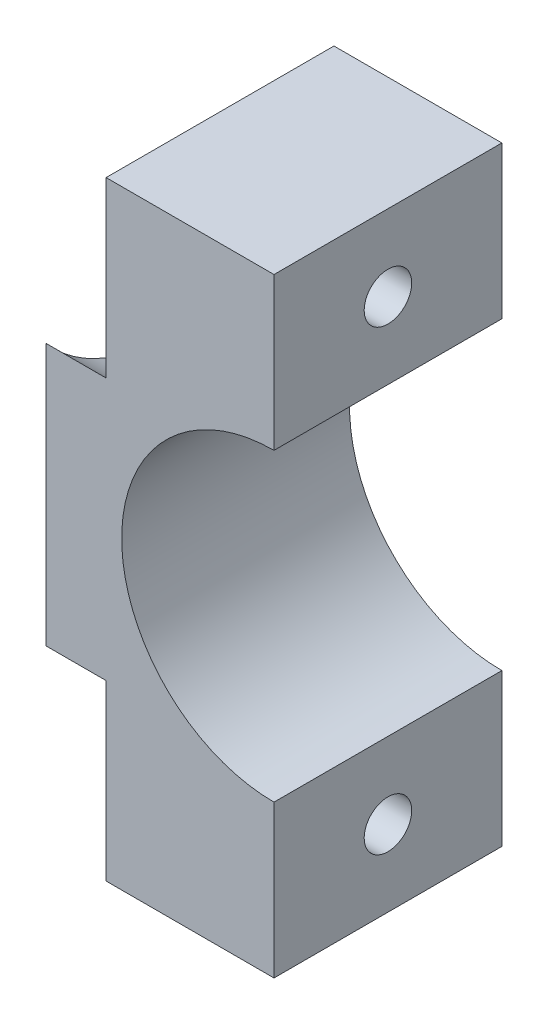
ISO-10303-21;
HEADER;
FILE_DESCRIPTION(('STEP AP214'),'2;1');
FILE_NAME('part.step','',(''),(''),'','','');
FILE_SCHEMA(('AUTOMOTIVE_DESIGN { 1 0 10303 214 1 1 1 1 }'));
ENDSEC;
DATA;
#1=APPLICATION_CONTEXT('core data for automotive mechanical design processes');
#2=APPLICATION_PROTOCOL_DEFINITION('international standard','automotive_design',2000,#1);
#3=PRODUCT_CONTEXT('',#1,'mechanical');
#4=PRODUCT('Part','Part','',(#3));
#5=PRODUCT_RELATED_PRODUCT_CATEGORY('part','',(#4));
#6=PRODUCT_DEFINITION_FORMATION('','',#4);
#7=PRODUCT_DEFINITION_CONTEXT('part definition',#1,'design');
#8=PRODUCT_DEFINITION('design','',#6,#7);
#9=PRODUCT_DEFINITION_SHAPE('','',#8);
#10=(LENGTH_UNIT() NAMED_UNIT(*) SI_UNIT(.MILLI.,.METRE.));
#11=(NAMED_UNIT(*) PLANE_ANGLE_UNIT() SI_UNIT($,.RADIAN.));
#12=(NAMED_UNIT(*) SI_UNIT($,.STERADIAN.) SOLID_ANGLE_UNIT());
#13=UNCERTAINTY_MEASURE_WITH_UNIT(LENGTH_MEASURE(1.E-05),#10,'distance_accuracy_value','');
#14=(GEOMETRIC_REPRESENTATION_CONTEXT(3) GLOBAL_UNCERTAINTY_ASSIGNED_CONTEXT((#13)) GLOBAL_UNIT_ASSIGNED_CONTEXT((#10,
#11,#12)) REPRESENTATION_CONTEXT('',''));
#15=CARTESIAN_POINT('',(0.,0.,0.));
#16=DIRECTION('',(0.,0.,1.));
#17=DIRECTION('',(1.,0.,0.));
#18=AXIS2_PLACEMENT_3D('',#15,#16,#17);
#19=CARTESIAN_POINT('',(-19.,10.925,19.));
#20=DIRECTION('',(0.,1.,0.));
#21=DIRECTION('',(0.,0.,1.));
#22=AXIS2_PLACEMENT_3D('',#19,#20,#21);
#23=PLANE('',#22);
#24=DIRECTION('',(-1.,0.,0.));
#25=VECTOR('',#24,1.);
#26=CARTESIAN_POINT('',(21.3553390593274,10.925,0.000822404018330225));
#27=LINE('',#26,#25);
#28=CARTESIAN_POINT('',(-14.,10.925,0.000822404018330225));
#29=VERTEX_POINT('',#28);
#30=CARTESIAN_POINT('',(-19.,10.925,0.000822404018330225));
#31=VERTEX_POINT('',#30);
#32=EDGE_CURVE('E63',#29,#31,#27,.T.);
#33=ORIENTED_EDGE('',*,*,#32,.F.);
#34=DIRECTION('',(0.,0.,-1.));
#35=VECTOR('',#34,1.);
#36=CARTESIAN_POINT('',(-14.,10.925,19.));
#37=LINE('',#36,#35);
#38=CARTESIAN_POINT('',(-14.,10.925,0.));
#39=VERTEX_POINT('',#38);
#40=EDGE_CURVE('E162',#29,#39,#37,.T.);
#41=ORIENTED_EDGE('',*,*,#40,.T.);
#42=DIRECTION('',(1.,0.,0.));
#43=VECTOR('',#42,1.);
#44=CARTESIAN_POINT('',(-19.,10.925,0.));
#45=LINE('',#44,#43);
#46=CARTESIAN_POINT('',(-19.,10.925,0.));
#47=VERTEX_POINT('',#46);
#48=EDGE_CURVE('E249',#47,#39,#45,.T.);
#49=ORIENTED_EDGE('',*,*,#48,.F.);
#50=DIRECTION('',(0.,0.,-1.));
#51=VECTOR('',#50,1.);
#52=CARTESIAN_POINT('',(-19.,10.925,19.));
#53=LINE('',#52,#51);
#54=EDGE_CURVE('E164',#31,#47,#53,.T.);
#55=ORIENTED_EDGE('',*,*,#54,.F.);
#56=EDGE_LOOP('',(#33,#41,#49,#55));
#57=FACE_BOUND('',#56,.T.);
#58=ADVANCED_FACE('F45',(#57),#23,.T.);
#59=CARTESIAN_POINT('',(-19.,-10.925,19.));
#60=DIRECTION('',(0.,1.,0.));
#61=DIRECTION('',(0.,0.,1.));
#62=AXIS2_PLACEMENT_3D('',#59,#60,#61);
#63=PLANE('',#62);
#64=DIRECTION('',(0.,0.,-1.));
#65=VECTOR('',#64,1.);
#66=CARTESIAN_POINT('',(-14.,-10.925,19.));
#67=LINE('',#66,#65);
#68=CARTESIAN_POINT('',(-14.,-10.925,0.000822404018338899));
#69=VERTEX_POINT('',#68);
#70=CARTESIAN_POINT('',(-14.,-10.925,0.));
#71=VERTEX_POINT('',#70);
#72=EDGE_CURVE('E192',#69,#71,#67,.T.);
#73=ORIENTED_EDGE('',*,*,#72,.F.);
#74=DIRECTION('',(-1.,0.,0.));
#75=VECTOR('',#74,1.);
#76=CARTESIAN_POINT('',(21.3553390593274,-10.925,0.000822404018338899));
#77=LINE('',#76,#75);
#78=CARTESIAN_POINT('',(-19.,-10.925,0.000822404018338899));
#79=VERTEX_POINT('',#78);
#80=EDGE_CURVE('E313',#69,#79,#77,.T.);
#81=ORIENTED_EDGE('',*,*,#80,.T.);
#82=DIRECTION('',(0.,0.,-1.));
#83=VECTOR('',#82,1.);
#84=CARTESIAN_POINT('',(-19.,-10.925,19.));
#85=LINE('',#84,#83);
#86=CARTESIAN_POINT('',(-19.,-10.925,0.));
#87=VERTEX_POINT('',#86);
#88=EDGE_CURVE('E187',#79,#87,#85,.T.);
#89=ORIENTED_EDGE('',*,*,#88,.T.);
#90=DIRECTION('',(1.,0.,0.));
#91=VECTOR('',#90,1.);
#92=CARTESIAN_POINT('',(-19.,-10.925,0.));
#93=LINE('',#92,#91);
#94=EDGE_CURVE('E241',#87,#71,#93,.T.);
#95=ORIENTED_EDGE('',*,*,#94,.T.);
#96=EDGE_LOOP('',(#73,#81,#89,#95));
#97=FACE_BOUND('',#96,.T.);
#98=ADVANCED_FACE('F312',(#97),#63,.F.);
#99=CARTESIAN_POINT('',(0.,25.4,19.));
#100=DIRECTION('',(1.,0.,0.));
#101=DIRECTION('',(0.,0.,-1.));
#102=AXIS2_PLACEMENT_3D('',#99,#100,#101);
#103=PLANE('',#102);
#104=CARTESIAN_POINT('',(0.,19.05,9.5));
#105=DIRECTION('',(-1.,0.,0.));
#106=DIRECTION('',(0.,0.,1.));
#107=AXIS2_PLACEMENT_3D('',#104,#105,#106);
#108=CIRCLE('',#107,1.98056896460038);
#109=CARTESIAN_POINT('',(0.,19.05,11.4805689646004));
#110=VERTEX_POINT('',#109);
#111=EDGE_CURVE('E227',#110,#110,#108,.T.);
#112=ORIENTED_EDGE('',*,*,#111,.T.);
#113=EDGE_LOOP('',(#112));
#114=FACE_BOUND('',#113,.T.);
#115=DIRECTION('',(0.,-1.,0.));
#116=VECTOR('',#115,1.);
#117=CARTESIAN_POINT('',(0.,25.4,0.));
#118=LINE('',#117,#116);
#119=CARTESIAN_POINT('',(0.,25.4,0.));
#120=VERTEX_POINT('',#119);
#121=CARTESIAN_POINT('',(0.,12.7,0.));
#122=VERTEX_POINT('',#121);
#123=EDGE_CURVE('E222',#120,#122,#118,.T.);
#124=ORIENTED_EDGE('',*,*,#123,.F.);
#125=DIRECTION('',(0.,0.,-1.));
#126=VECTOR('',#125,1.);
#127=CARTESIAN_POINT('',(0.,25.4,19.));
#128=LINE('',#127,#126);
#129=CARTESIAN_POINT('',(0.,25.4,19.));
#130=VERTEX_POINT('',#129);
#131=EDGE_CURVE('E11',#130,#120,#128,.T.);
#132=ORIENTED_EDGE('',*,*,#131,.F.);
#133=DIRECTION('',(0.,-1.,0.));
#134=VECTOR('',#133,1.);
#135=CARTESIAN_POINT('',(0.,25.4,19.));
#136=LINE('',#135,#134);
#137=CARTESIAN_POINT('',(0.,12.7,19.));
#138=VERTEX_POINT('',#137);
#139=EDGE_CURVE('E256',#130,#138,#136,.T.);
#140=ORIENTED_EDGE('',*,*,#139,.T.);
#141=DIRECTION('',(0.,0.,-1.));
#142=VECTOR('',#141,1.);
#143=CARTESIAN_POINT('',(0.,12.7,19.));
#144=LINE('',#143,#142);
#145=EDGE_CURVE('E49',#138,#122,#144,.T.);
#146=ORIENTED_EDGE('',*,*,#145,.T.);
#147=EDGE_LOOP('',(#124,#132,#140,#146));
#148=FACE_BOUND('',#147,.T.);
#149=ADVANCED_FACE('F47',(#114,#148),#103,.T.);
#150=CARTESIAN_POINT('',(0.,25.4,19.));
#151=DIRECTION('',(0.,-1.,0.));
#152=DIRECTION('',(0.,0.,-1.));
#153=AXIS2_PLACEMENT_3D('',#150,#151,#152);
#154=PLANE('',#153);
#155=DIRECTION('',(-1.,0.,0.));
#156=VECTOR('',#155,1.);
#157=CARTESIAN_POINT('',(0.,25.4,0.));
#158=LINE('',#157,#156);
#159=CARTESIAN_POINT('',(-14.,25.4,0.));
#160=VERTEX_POINT('',#159);
#161=EDGE_CURVE('E254',#120,#160,#158,.T.);
#162=ORIENTED_EDGE('',*,*,#161,.T.);
#163=DIRECTION('',(0.,0.,-1.));
#164=VECTOR('',#163,1.);
#165=CARTESIAN_POINT('',(-14.,25.4,19.));
#166=LINE('',#165,#164);
#167=CARTESIAN_POINT('',(-14.,25.4,19.));
#168=VERTEX_POINT('',#167);
#169=EDGE_CURVE('E55',#168,#160,#166,.T.);
#170=ORIENTED_EDGE('',*,*,#169,.F.);
#171=DIRECTION('',(-1.,0.,0.));
#172=VECTOR('',#171,1.);
#173=CARTESIAN_POINT('',(0.,25.4,19.));
#174=LINE('',#173,#172);
#175=EDGE_CURVE('E206',#130,#168,#174,.T.);
#176=ORIENTED_EDGE('',*,*,#175,.F.);
#177=ORIENTED_EDGE('',*,*,#131,.T.);
#178=EDGE_LOOP('',(#162,#170,#176,#177));
#179=FACE_BOUND('',#178,.T.);
#180=ADVANCED_FACE('F387',(#179),#154,.F.);
#181=CARTESIAN_POINT('',(-14.,25.4,19.));
#182=DIRECTION('',(1.,0.,0.));
#183=DIRECTION('',(0.,0.,-1.));
#184=AXIS2_PLACEMENT_3D('',#181,#182,#183);
#185=PLANE('',#184);
#186=ORIENTED_EDGE('',*,*,#40,.F.);
#187=CARTESIAN_POINT('',(-14.,19.05,9.5));
#188=DIRECTION('',(1.,0.,0.));
#189=DIRECTION('',(0.,0.,-1.));
#190=AXIS2_PLACEMENT_3D('',#187,#188,#189);
#191=CIRCLE('',#190,12.5);
#192=CARTESIAN_POINT('',(-14.,10.925,18.9991775959817));
#193=VERTEX_POINT('',#192);
#194=EDGE_CURVE('E146',#29,#193,#191,.F.);
#195=ORIENTED_EDGE('',*,*,#194,.T.);
#196=CARTESIAN_POINT('',(-14.,10.925,19.));
#197=VERTEX_POINT('',#196);
#198=EDGE_CURVE('E174',#197,#193,#37,.T.);
#199=ORIENTED_EDGE('',*,*,#198,.F.);
#200=DIRECTION('',(0.,-1.,0.));
#201=VECTOR('',#200,1.);
#202=CARTESIAN_POINT('',(-14.,25.4,19.));
#203=LINE('',#202,#201);
#204=EDGE_CURVE('E211',#168,#197,#203,.T.);
#205=ORIENTED_EDGE('',*,*,#204,.F.);
#206=ORIENTED_EDGE('',*,*,#169,.T.);
#207=DIRECTION('',(0.,-1.,0.));
#208=VECTOR('',#207,1.);
#209=CARTESIAN_POINT('',(-14.,25.4,0.));
#210=LINE('',#209,#208);
#211=EDGE_CURVE('E172',#160,#39,#210,.T.);
#212=ORIENTED_EDGE('',*,*,#211,.T.);
#213=EDGE_LOOP('',(#186,#195,#199,#205,#206,#212));
#214=FACE_BOUND('',#213,.T.);
#215=CARTESIAN_POINT('',(-14.,19.05,9.5));
#216=DIRECTION('',(-1.,0.,0.));
#217=DIRECTION('',(0.,0.,1.));
#218=AXIS2_PLACEMENT_3D('',#215,#216,#217);
#219=CIRCLE('',#218,1.98056896460038);
#220=CARTESIAN_POINT('',(-14.,19.05,11.4805689646004));
#221=VERTEX_POINT('',#220);
#222=EDGE_CURVE('E325',#221,#221,#219,.T.);
#223=ORIENTED_EDGE('',*,*,#222,.F.);
#224=EDGE_LOOP('',(#223));
#225=FACE_BOUND('',#224,.T.);
#226=ADVANCED_FACE('F168',(#214,#225),#185,.F.);
#227=DIRECTION('',(-1.,0.,0.));
#228=VECTOR('',#227,1.);
#229=CARTESIAN_POINT('',(21.3553390593274,10.925,18.9991775959817));
#230=LINE('',#229,#228);
#231=CARTESIAN_POINT('',(-19.,10.925,18.9991775959817));
#232=VERTEX_POINT('',#231);
#233=EDGE_CURVE('E149',#232,#193,#230,.F.);
#234=ORIENTED_EDGE('',*,*,#233,.F.);
#235=CARTESIAN_POINT('',(-19.,10.925,19.));
#236=VERTEX_POINT('',#235);
#237=EDGE_CURVE('E175',#236,#232,#53,.T.);
#238=ORIENTED_EDGE('',*,*,#237,.F.);
#239=DIRECTION('',(1.,0.,0.));
#240=VECTOR('',#239,1.);
#241=CARTESIAN_POINT('',(-19.,10.925,19.));
#242=LINE('',#241,#240);
#243=EDGE_CURVE('E218',#236,#197,#242,.T.);
#244=ORIENTED_EDGE('',*,*,#243,.T.);
#245=ORIENTED_EDGE('',*,*,#198,.T.);
#246=EDGE_LOOP('',(#234,#238,#244,#245));
#247=FACE_BOUND('',#246,.T.);
#248=ADVANCED_FACE('F287',(#247),#23,.T.);
#249=CARTESIAN_POINT('',(-19.,10.925,19.));
#250=DIRECTION('',(1.,0.,0.));
#251=DIRECTION('',(0.,0.,-1.));
#252=AXIS2_PLACEMENT_3D('',#249,#250,#251);
#253=PLANE('',#252);
#254=ORIENTED_EDGE('',*,*,#237,.T.);
#255=CARTESIAN_POINT('',(-19.,19.05,9.5));
#256=DIRECTION('',(-1.,0.,0.));
#257=DIRECTION('',(0.,0.,1.));
#258=AXIS2_PLACEMENT_3D('',#255,#256,#257);
#259=CIRCLE('',#258,12.5);
#260=EDGE_CURVE('E156',#31,#232,#259,.T.);
#261=ORIENTED_EDGE('',*,*,#260,.F.);
#262=ORIENTED_EDGE('',*,*,#54,.T.);
#263=DIRECTION('',(0.,-1.,0.));
#264=VECTOR('',#263,1.);
#265=CARTESIAN_POINT('',(-19.,10.925,0.));
#266=LINE('',#265,#264);
#267=EDGE_CURVE('E245',#47,#87,#266,.T.);
#268=ORIENTED_EDGE('',*,*,#267,.T.);
#269=ORIENTED_EDGE('',*,*,#88,.F.);
#270=CARTESIAN_POINT('',(-19.,-19.05,9.5));
#271=DIRECTION('',(-1.,0.,0.));
#272=DIRECTION('',(0.,0.,1.));
#273=AXIS2_PLACEMENT_3D('',#270,#271,#272);
#274=CIRCLE('',#273,12.5);
#275=CARTESIAN_POINT('',(-19.,-10.925,18.9991775959817));
#276=VERTEX_POINT('',#275);
#277=EDGE_CURVE('E357',#276,#79,#274,.T.);
#278=ORIENTED_EDGE('',*,*,#277,.F.);
#279=CARTESIAN_POINT('',(-19.,-10.925,19.));
#280=VERTEX_POINT('',#279);
#281=EDGE_CURVE('E183',#280,#276,#85,.T.);
#282=ORIENTED_EDGE('',*,*,#281,.F.);
#283=DIRECTION('',(0.,-1.,0.));
#284=VECTOR('',#283,1.);
#285=CARTESIAN_POINT('',(-19.,10.925,19.));
#286=LINE('',#285,#284);
#287=EDGE_CURVE('E281',#236,#280,#286,.T.);
#288=ORIENTED_EDGE('',*,*,#287,.F.);
#289=EDGE_LOOP('',(#254,#261,#262,#268,#269,#278,#282,#288));
#290=FACE_BOUND('',#289,.T.);
#291=ADVANCED_FACE('F299',(#290),#253,.F.);
#292=ORIENTED_EDGE('',*,*,#281,.T.);
#293=DIRECTION('',(-1.,0.,0.));
#294=VECTOR('',#293,1.);
#295=CARTESIAN_POINT('',(21.3553390593274,-10.925,18.9991775959817));
#296=LINE('',#295,#294);
#297=CARTESIAN_POINT('',(-14.,-10.925,18.9991775959817));
#298=VERTEX_POINT('',#297);
#299=EDGE_CURVE('E155',#276,#298,#296,.F.);
#300=ORIENTED_EDGE('',*,*,#299,.T.);
#301=CARTESIAN_POINT('',(-14.,-10.925,19.));
#302=VERTEX_POINT('',#301);
#303=EDGE_CURVE('E188',#302,#298,#67,.T.);
#304=ORIENTED_EDGE('',*,*,#303,.F.);
#305=DIRECTION('',(1.,0.,0.));
#306=VECTOR('',#305,1.);
#307=CARTESIAN_POINT('',(-19.,-10.925,19.));
#308=LINE('',#307,#306);
#309=EDGE_CURVE('E277',#280,#302,#308,.T.);
#310=ORIENTED_EDGE('',*,*,#309,.F.);
#311=EDGE_LOOP('',(#292,#300,#304,#310));
#312=FACE_BOUND('',#311,.T.);
#313=ADVANCED_FACE('F355',(#312),#63,.F.);
#314=CARTESIAN_POINT('',(-14.,-25.4,19.));
#315=DIRECTION('',(-1.,0.,0.));
#316=DIRECTION('',(0.,0.,1.));
#317=AXIS2_PLACEMENT_3D('',#314,#315,#316);
#318=PLANE('',#317);
#319=ORIENTED_EDGE('',*,*,#72,.T.);
#320=DIRECTION('',(0.,1.,0.));
#321=VECTOR('',#320,1.);
#322=CARTESIAN_POINT('',(-14.,-25.4,0.));
#323=LINE('',#322,#321);
#324=CARTESIAN_POINT('',(-14.,-25.4,0.));
#325=VERTEX_POINT('',#324);
#326=EDGE_CURVE('E238',#325,#71,#323,.T.);
#327=ORIENTED_EDGE('',*,*,#326,.F.);
#328=DIRECTION('',(0.,0.,-1.));
#329=VECTOR('',#328,1.);
#330=CARTESIAN_POINT('',(-14.,-25.4,19.));
#331=LINE('',#330,#329);
#332=CARTESIAN_POINT('',(-14.,-25.4,19.));
#333=VERTEX_POINT('',#332);
#334=EDGE_CURVE('E193',#333,#325,#331,.T.);
#335=ORIENTED_EDGE('',*,*,#334,.F.);
#336=DIRECTION('',(0.,1.,0.));
#337=VECTOR('',#336,1.);
#338=CARTESIAN_POINT('',(-14.,-25.4,19.));
#339=LINE('',#338,#337);
#340=EDGE_CURVE('E274',#333,#302,#339,.T.);
#341=ORIENTED_EDGE('',*,*,#340,.T.);
#342=ORIENTED_EDGE('',*,*,#303,.T.);
#343=CARTESIAN_POINT('',(-14.,-19.05,9.5));
#344=DIRECTION('',(1.,0.,0.));
#345=DIRECTION('',(0.,0.,-1.));
#346=AXIS2_PLACEMENT_3D('',#343,#344,#345);
#347=CIRCLE('',#346,12.5);
#348=EDGE_CURVE('E71',#298,#69,#347,.F.);
#349=ORIENTED_EDGE('',*,*,#348,.T.);
#350=EDGE_LOOP('',(#319,#327,#335,#341,#342,#349));
#351=FACE_BOUND('',#350,.T.);
#352=CARTESIAN_POINT('',(-14.,-19.05,9.5));
#353=DIRECTION('',(1.,0.,0.));
#354=DIRECTION('',(0.,0.,-1.));
#355=AXIS2_PLACEMENT_3D('',#352,#353,#354);
#356=CIRCLE('',#355,1.98056896460038);
#357=CARTESIAN_POINT('',(-14.,-19.05,11.4805689646004));
#358=VERTEX_POINT('',#357);
#359=EDGE_CURVE('E328',#358,#358,#356,.T.);
#360=ORIENTED_EDGE('',*,*,#359,.T.);
#361=EDGE_LOOP('',(#360));
#362=FACE_BOUND('',#361,.T.);
#363=ADVANCED_FACE('F308',(#351,#362),#318,.T.);
#364=CARTESIAN_POINT('',(0.,-25.4,19.));
#365=DIRECTION('',(0.,-1.,0.));
#366=DIRECTION('',(0.,0.,-1.));
#367=AXIS2_PLACEMENT_3D('',#364,#365,#366);
#368=PLANE('',#367);
#369=DIRECTION('',(-1.,0.,0.));
#370=VECTOR('',#369,1.);
#371=CARTESIAN_POINT('',(0.,-25.4,0.));
#372=LINE('',#371,#370);
#373=CARTESIAN_POINT('',(0.,-25.4,0.));
#374=VERTEX_POINT('',#373);
#375=EDGE_CURVE('E234',#374,#325,#372,.T.);
#376=ORIENTED_EDGE('',*,*,#375,.F.);
#377=DIRECTION('',(0.,0.,-1.));
#378=VECTOR('',#377,1.);
#379=CARTESIAN_POINT('',(0.,-25.4,19.));
#380=LINE('',#379,#378);
#381=CARTESIAN_POINT('',(0.,-25.4,19.));
#382=VERTEX_POINT('',#381);
#383=EDGE_CURVE('E196',#382,#374,#380,.T.);
#384=ORIENTED_EDGE('',*,*,#383,.F.);
#385=DIRECTION('',(-1.,0.,0.));
#386=VECTOR('',#385,1.);
#387=CARTESIAN_POINT('',(0.,-25.4,19.));
#388=LINE('',#387,#386);
#389=EDGE_CURVE('E270',#382,#333,#388,.T.);
#390=ORIENTED_EDGE('',*,*,#389,.T.);
#391=ORIENTED_EDGE('',*,*,#334,.T.);
#392=EDGE_LOOP('',(#376,#384,#390,#391));
#393=FACE_BOUND('',#392,.T.);
#394=ADVANCED_FACE('F343',(#393),#368,.T.);
#395=CARTESIAN_POINT('',(0.,-25.4,19.));
#396=DIRECTION('',(-1.,0.,0.));
#397=DIRECTION('',(0.,0.,1.));
#398=AXIS2_PLACEMENT_3D('',#395,#396,#397);
#399=PLANE('',#398);
#400=CARTESIAN_POINT('',(0.,-19.05,9.5));
#401=DIRECTION('',(1.,0.,0.));
#402=DIRECTION('',(0.,0.,-1.));
#403=AXIS2_PLACEMENT_3D('',#400,#401,#402);
#404=CIRCLE('',#403,1.98056896460038);
#405=CARTESIAN_POINT('',(0.,-19.05,11.4805689646004));
#406=VERTEX_POINT('',#405);
#407=EDGE_CURVE('E166',#406,#406,#404,.T.);
#408=ORIENTED_EDGE('',*,*,#407,.F.);
#409=EDGE_LOOP('',(#408));
#410=FACE_BOUND('',#409,.T.);
#411=DIRECTION('',(0.,1.,0.));
#412=VECTOR('',#411,1.);
#413=CARTESIAN_POINT('',(0.,-25.4,0.));
#414=LINE('',#413,#412);
#415=CARTESIAN_POINT('',(0.,-12.7,0.));
#416=VERTEX_POINT('',#415);
#417=EDGE_CURVE('E231',#374,#416,#414,.T.);
#418=ORIENTED_EDGE('',*,*,#417,.T.);
#419=DIRECTION('',(0.,0.,-1.));
#420=VECTOR('',#419,1.);
#421=CARTESIAN_POINT('',(0.,-12.7,19.));
#422=LINE('',#421,#420);
#423=CARTESIAN_POINT('',(0.,-12.7,19.));
#424=VERTEX_POINT('',#423);
#425=EDGE_CURVE('E198',#424,#416,#422,.T.);
#426=ORIENTED_EDGE('',*,*,#425,.F.);
#427=DIRECTION('',(0.,1.,0.));
#428=VECTOR('',#427,1.);
#429=CARTESIAN_POINT('',(0.,-25.4,19.));
#430=LINE('',#429,#428);
#431=EDGE_CURVE('E263',#382,#424,#430,.T.);
#432=ORIENTED_EDGE('',*,*,#431,.F.);
#433=ORIENTED_EDGE('',*,*,#383,.T.);
#434=EDGE_LOOP('',(#418,#426,#432,#433));
#435=FACE_BOUND('',#434,.T.);
#436=ADVANCED_FACE('F339',(#410,#435),#399,.F.);
#437=CARTESIAN_POINT('',(0.,0.,19.));
#438=DIRECTION('',(0.,0.,-1.));
#439=DIRECTION('',(-1.,0.,0.));
#440=AXIS2_PLACEMENT_3D('',#437,#438,#439);
#441=CYLINDRICAL_SURFACE('',#440,12.7);
#442=CARTESIAN_POINT('',(0.,0.,0.));
#443=DIRECTION('',(0.,0.,1.));
#444=DIRECTION('',(1.,0.,0.));
#445=AXIS2_PLACEMENT_3D('',#442,#443,#444);
#446=CIRCLE('',#445,12.7);
#447=EDGE_CURVE('E226',#122,#416,#446,.T.);
#448=ORIENTED_EDGE('',*,*,#447,.F.);
#449=ORIENTED_EDGE('',*,*,#145,.F.);
#450=CARTESIAN_POINT('',(0.,0.,19.));
#451=DIRECTION('',(0.,0.,1.));
#452=DIRECTION('',(1.,0.,0.));
#453=AXIS2_PLACEMENT_3D('',#450,#451,#452);
#454=CIRCLE('',#453,12.7);
#455=EDGE_CURVE('E260',#138,#424,#454,.T.);
#456=ORIENTED_EDGE('',*,*,#455,.T.);
#457=ORIENTED_EDGE('',*,*,#425,.T.);
#458=EDGE_LOOP('',(#448,#449,#456,#457));
#459=FACE_BOUND('',#458,.T.);
#460=ADVANCED_FACE('F342',(#459),#441,.F.);
#461=CARTESIAN_POINT('',(0.,0.,19.));
#462=DIRECTION('',(0.,0.,1.));
#463=DIRECTION('',(1.,0.,0.));
#464=AXIS2_PLACEMENT_3D('',#461,#462,#463);
#465=PLANE('',#464);
#466=ORIENTED_EDGE('',*,*,#139,.F.);
#467=ORIENTED_EDGE('',*,*,#175,.T.);
#468=ORIENTED_EDGE('',*,*,#204,.T.);
#469=ORIENTED_EDGE('',*,*,#243,.F.);
#470=ORIENTED_EDGE('',*,*,#287,.T.);
#471=ORIENTED_EDGE('',*,*,#309,.T.);
#472=ORIENTED_EDGE('',*,*,#340,.F.);
#473=ORIENTED_EDGE('',*,*,#389,.F.);
#474=ORIENTED_EDGE('',*,*,#431,.T.);
#475=ORIENTED_EDGE('',*,*,#455,.F.);
#476=EDGE_LOOP('',(#466,#467,#468,#469,#470,#471,#472,#473,#474,#475));
#477=FACE_BOUND('',#476,.T.);
#478=ADVANCED_FACE('F289',(#477),#465,.T.);
#479=CARTESIAN_POINT('',(0.,0.,0.));
#480=DIRECTION('',(0.,0.,1.));
#481=DIRECTION('',(1.,0.,0.));
#482=AXIS2_PLACEMENT_3D('',#479,#480,#481);
#483=PLANE('',#482);
#484=ORIENTED_EDGE('',*,*,#123,.T.);
#485=ORIENTED_EDGE('',*,*,#447,.T.);
#486=ORIENTED_EDGE('',*,*,#417,.F.);
#487=ORIENTED_EDGE('',*,*,#375,.T.);
#488=ORIENTED_EDGE('',*,*,#326,.T.);
#489=ORIENTED_EDGE('',*,*,#94,.F.);
#490=ORIENTED_EDGE('',*,*,#267,.F.);
#491=ORIENTED_EDGE('',*,*,#48,.T.);
#492=ORIENTED_EDGE('',*,*,#211,.F.);
#493=ORIENTED_EDGE('',*,*,#161,.F.);
#494=EDGE_LOOP('',(#484,#485,#486,#487,#488,#489,#490,#491,#492,#493));
#495=FACE_BOUND('',#494,.T.);
#496=ADVANCED_FACE('F294',(#495),#483,.F.);
#497=CARTESIAN_POINT('',(0.,-19.05,9.5));
#498=DIRECTION('',(-1.,0.,0.));
#499=DIRECTION('',(0.,0.,1.));
#500=AXIS2_PLACEMENT_3D('',#497,#498,#499);
#501=CYLINDRICAL_SURFACE('',#500,1.98056896460038);
#502=CARTESIAN_POINT('',(0.,-19.05,11.4805689646004));
#503=CARTESIAN_POINT('',(-0.145833333333334,-19.05,11.4805689646004));
#504=CARTESIAN_POINT('',(-0.291666666666667,-19.05,11.4805689646004));
#505=CARTESIAN_POINT('',(-0.583333333333333,-19.05,11.4805689646004));
#506=CARTESIAN_POINT('',(-0.729166666666667,-19.05,11.4805689646004));
#507=CARTESIAN_POINT('',(-1.02083333333333,-19.05,11.4805689646004));
#508=CARTESIAN_POINT('',(-1.16666666666667,-19.05,11.4805689646004));
#509=CARTESIAN_POINT('',(-1.45833333333333,-19.05,11.4805689646004));
#510=CARTESIAN_POINT('',(-1.60416666666667,-19.05,11.4805689646004));
#511=CARTESIAN_POINT('',(-1.89583333333333,-19.05,11.4805689646004));
#512=CARTESIAN_POINT('',(-2.04166666666667,-19.05,11.4805689646004));
#513=CARTESIAN_POINT('',(-2.33333333333333,-19.05,11.4805689646004));
#514=CARTESIAN_POINT('',(-2.47916666666667,-19.05,11.4805689646004));
#515=CARTESIAN_POINT('',(-2.77083333333333,-19.05,11.4805689646004));
#516=CARTESIAN_POINT('',(-2.91666666666667,-19.05,11.4805689646004));
#517=CARTESIAN_POINT('',(-3.20833333333333,-19.05,11.4805689646004));
#518=CARTESIAN_POINT('',(-3.35416666666667,-19.05,11.4805689646004));
#519=CARTESIAN_POINT('',(-3.64583333333333,-19.05,11.4805689646004));
#520=CARTESIAN_POINT('',(-3.79166666666667,-19.05,11.4805689646004));
#521=CARTESIAN_POINT('',(-4.08333333333333,-19.05,11.4805689646004));
#522=CARTESIAN_POINT('',(-4.22916666666667,-19.05,11.4805689646004));
#523=CARTESIAN_POINT('',(-4.52083333333333,-19.05,11.4805689646004));
#524=CARTESIAN_POINT('',(-4.66666666666667,-19.05,11.4805689646004));
#525=CARTESIAN_POINT('',(-4.95833333333333,-19.05,11.4805689646004));
#526=CARTESIAN_POINT('',(-5.10416666666667,-19.05,11.4805689646004));
#527=CARTESIAN_POINT('',(-5.39583333333333,-19.05,11.4805689646004));
#528=CARTESIAN_POINT('',(-5.54166666666667,-19.05,11.4805689646004));
#529=CARTESIAN_POINT('',(-5.83333333333333,-19.05,11.4805689646004));
#530=CARTESIAN_POINT('',(-5.97916666666667,-19.05,11.4805689646004));
#531=CARTESIAN_POINT('',(-6.27083333333333,-19.05,11.4805689646004));
#532=CARTESIAN_POINT('',(-6.41666666666667,-19.05,11.4805689646004));
#533=CARTESIAN_POINT('',(-6.70833333333333,-19.05,11.4805689646004));
#534=CARTESIAN_POINT('',(-6.85416666666667,-19.05,11.4805689646004));
#535=CARTESIAN_POINT('',(-7.14583333333333,-19.05,11.4805689646004));
#536=CARTESIAN_POINT('',(-7.29166666666667,-19.05,11.4805689646004));
#537=CARTESIAN_POINT('',(-7.58333333333333,-19.05,11.4805689646004));
#538=CARTESIAN_POINT('',(-7.72916666666667,-19.05,11.4805689646004));
#539=CARTESIAN_POINT('',(-8.02083333333333,-19.05,11.4805689646004));
#540=CARTESIAN_POINT('',(-8.16666666666667,-19.05,11.4805689646004));
#541=CARTESIAN_POINT('',(-8.45833333333333,-19.05,11.4805689646004));
#542=CARTESIAN_POINT('',(-8.60416666666667,-19.05,11.4805689646004));
#543=CARTESIAN_POINT('',(-8.89583333333333,-19.05,11.4805689646004));
#544=CARTESIAN_POINT('',(-9.04166666666667,-19.05,11.4805689646004));
#545=CARTESIAN_POINT('',(-9.33333333333333,-19.05,11.4805689646004));
#546=CARTESIAN_POINT('',(-9.47916666666667,-19.05,11.4805689646004));
#547=CARTESIAN_POINT('',(-9.77083333333333,-19.05,11.4805689646004));
#548=CARTESIAN_POINT('',(-9.91666666666667,-19.05,11.4805689646004));
#549=CARTESIAN_POINT('',(-10.2083333333333,-19.05,11.4805689646004));
#550=CARTESIAN_POINT('',(-10.3541666666667,-19.05,11.4805689646004));
#551=CARTESIAN_POINT('',(-10.6458333333333,-19.05,11.4805689646004));
#552=CARTESIAN_POINT('',(-10.7916666666667,-19.05,11.4805689646004));
#553=CARTESIAN_POINT('',(-11.0833333333333,-19.05,11.4805689646004));
#554=CARTESIAN_POINT('',(-11.2291666666667,-19.05,11.4805689646004));
#555=CARTESIAN_POINT('',(-11.5208333333333,-19.05,11.4805689646004));
#556=CARTESIAN_POINT('',(-11.6666666666667,-19.05,11.4805689646004));
#557=CARTESIAN_POINT('',(-11.9583333333333,-19.05,11.4805689646004));
#558=CARTESIAN_POINT('',(-12.1041666666667,-19.05,11.4805689646004));
#559=CARTESIAN_POINT('',(-12.3958333333333,-19.05,11.4805689646004));
#560=CARTESIAN_POINT('',(-12.5416666666667,-19.05,11.4805689646004));
#561=CARTESIAN_POINT('',(-12.8333333333333,-19.05,11.4805689646004));
#562=CARTESIAN_POINT('',(-12.9791666666667,-19.05,11.4805689646004));
#563=CARTESIAN_POINT('',(-13.2708333333333,-19.05,11.4805689646004));
#564=CARTESIAN_POINT('',(-13.4166666666667,-19.05,11.4805689646004));
#565=CARTESIAN_POINT('',(-13.7083333333333,-19.05,11.4805689646004));
#566=CARTESIAN_POINT('',(-13.8541666666667,-19.05,11.4805689646004));
#567=CARTESIAN_POINT('',(-14.,-19.05,11.4805689646004));
#568=B_SPLINE_CURVE_WITH_KNOTS('',3,(#502,#503,#504,#505,#506,#507,#508,#509,#510,#511,#512,
#513,#514,#515,#516,#517,#518,#519,#520,#521,#522,#523,#524,#525,#526,#527,#528,#529,#530,#531,
#532,#533,#534,#535,#536,#537,#538,#539,#540,#541,#542,#543,#544,#545,#546,#547,#548,#549,#550,
#551,#552,#553,#554,#555,#556,#557,#558,#559,#560,#561,#562,#563,#564,#565,#566,#567),
.UNSPECIFIED.,.F.,.F.,(4,2,2,2,2,2,2,2,2,2,2,2,2,2,2,2,2,2,2,2,2,2,2,2,2,2,2,2,2,2,2,2,4),(0.,
0.4375,0.875,1.3125,1.75,2.1875,2.625,3.0625,3.5,3.9375,4.375,4.8125,5.25,5.6875,6.125,6.5625,
7.,7.4375,7.875,8.3125,8.75,9.1875,9.625,10.0625,10.5,10.9375,11.375,11.8125,12.25,12.6875,
13.125,13.5625,14.),.UNSPECIFIED.);
#569=EDGE_CURVE('BSEAM336',#406,#358,#568,.T.);
#570=ORIENTED_EDGE('',*,*,#407,.T.);
#571=ORIENTED_EDGE('',*,*,#359,.F.);
#572=ORIENTED_EDGE('',*,*,#569,.T.);
#573=ORIENTED_EDGE('',*,*,#569,.F.);
#574=EDGE_LOOP('',(#570,#572,#571,#573));
#575=FACE_BOUND('',#574,.T.);
#576=ADVANCED_FACE('F336',(#575),#501,.F.);
#577=CARTESIAN_POINT('',(0.,19.05,9.5));
#578=DIRECTION('',(-1.,0.,0.));
#579=DIRECTION('',(0.,0.,1.));
#580=AXIS2_PLACEMENT_3D('',#577,#578,#579);
#581=CYLINDRICAL_SURFACE('',#580,1.98056896460038);
#582=CARTESIAN_POINT('',(0.,19.05,11.4805689646004));
#583=CARTESIAN_POINT('',(-0.145833333333333,19.05,11.4805689646004));
#584=CARTESIAN_POINT('',(-0.291666666666667,19.05,11.4805689646004));
#585=CARTESIAN_POINT('',(-0.583333333333333,19.05,11.4805689646004));
#586=CARTESIAN_POINT('',(-0.729166666666667,19.05,11.4805689646004));
#587=CARTESIAN_POINT('',(-1.02083333333333,19.05,11.4805689646004));
#588=CARTESIAN_POINT('',(-1.16666666666667,19.05,11.4805689646004));
#589=CARTESIAN_POINT('',(-1.45833333333333,19.05,11.4805689646004));
#590=CARTESIAN_POINT('',(-1.60416666666667,19.05,11.4805689646004));
#591=CARTESIAN_POINT('',(-1.89583333333333,19.05,11.4805689646004));
#592=CARTESIAN_POINT('',(-2.04166666666667,19.05,11.4805689646004));
#593=CARTESIAN_POINT('',(-2.33333333333333,19.05,11.4805689646004));
#594=CARTESIAN_POINT('',(-2.47916666666667,19.05,11.4805689646004));
#595=CARTESIAN_POINT('',(-2.77083333333333,19.05,11.4805689646004));
#596=CARTESIAN_POINT('',(-2.91666666666667,19.05,11.4805689646004));
#597=CARTESIAN_POINT('',(-3.20833333333333,19.05,11.4805689646004));
#598=CARTESIAN_POINT('',(-3.35416666666667,19.05,11.4805689646004));
#599=CARTESIAN_POINT('',(-3.64583333333333,19.05,11.4805689646004));
#600=CARTESIAN_POINT('',(-3.79166666666667,19.05,11.4805689646004));
#601=CARTESIAN_POINT('',(-4.08333333333333,19.05,11.4805689646004));
#602=CARTESIAN_POINT('',(-4.22916666666667,19.05,11.4805689646004));
#603=CARTESIAN_POINT('',(-4.52083333333333,19.05,11.4805689646004));
#604=CARTESIAN_POINT('',(-4.66666666666667,19.05,11.4805689646004));
#605=CARTESIAN_POINT('',(-4.95833333333333,19.05,11.4805689646004));
#606=CARTESIAN_POINT('',(-5.10416666666667,19.05,11.4805689646004));
#607=CARTESIAN_POINT('',(-5.39583333333333,19.05,11.4805689646004));
#608=CARTESIAN_POINT('',(-5.54166666666667,19.05,11.4805689646004));
#609=CARTESIAN_POINT('',(-5.83333333333333,19.05,11.4805689646004));
#610=CARTESIAN_POINT('',(-5.97916666666667,19.05,11.4805689646004));
#611=CARTESIAN_POINT('',(-6.27083333333333,19.05,11.4805689646004));
#612=CARTESIAN_POINT('',(-6.41666666666667,19.05,11.4805689646004));
#613=CARTESIAN_POINT('',(-6.70833333333333,19.05,11.4805689646004));
#614=CARTESIAN_POINT('',(-6.85416666666666,19.05,11.4805689646004));
#615=CARTESIAN_POINT('',(-7.14583333333333,19.05,11.4805689646004));
#616=CARTESIAN_POINT('',(-7.29166666666667,19.05,11.4805689646004));
#617=CARTESIAN_POINT('',(-7.58333333333333,19.05,11.4805689646004));
#618=CARTESIAN_POINT('',(-7.72916666666667,19.05,11.4805689646004));
#619=CARTESIAN_POINT('',(-8.02083333333333,19.05,11.4805689646004));
#620=CARTESIAN_POINT('',(-8.16666666666666,19.05,11.4805689646004));
#621=CARTESIAN_POINT('',(-8.45833333333333,19.05,11.4805689646004));
#622=CARTESIAN_POINT('',(-8.60416666666666,19.05,11.4805689646004));
#623=CARTESIAN_POINT('',(-8.89583333333333,19.05,11.4805689646004));
#624=CARTESIAN_POINT('',(-9.04166666666666,19.05,11.4805689646004));
#625=CARTESIAN_POINT('',(-9.33333333333333,19.05,11.4805689646004));
#626=CARTESIAN_POINT('',(-9.47916666666666,19.05,11.4805689646004));
#627=CARTESIAN_POINT('',(-9.77083333333333,19.05,11.4805689646004));
#628=CARTESIAN_POINT('',(-9.91666666666666,19.05,11.4805689646004));
#629=CARTESIAN_POINT('',(-10.2083333333333,19.05,11.4805689646004));
#630=CARTESIAN_POINT('',(-10.3541666666667,19.05,11.4805689646004));
#631=CARTESIAN_POINT('',(-10.6458333333333,19.05,11.4805689646004));
#632=CARTESIAN_POINT('',(-10.7916666666667,19.05,11.4805689646004));
#633=CARTESIAN_POINT('',(-11.0833333333333,19.05,11.4805689646004));
#634=CARTESIAN_POINT('',(-11.2291666666667,19.05,11.4805689646004));
#635=CARTESIAN_POINT('',(-11.5208333333333,19.05,11.4805689646004));
#636=CARTESIAN_POINT('',(-11.6666666666667,19.05,11.4805689646004));
#637=CARTESIAN_POINT('',(-11.9583333333333,19.05,11.4805689646004));
#638=CARTESIAN_POINT('',(-12.1041666666667,19.05,11.4805689646004));
#639=CARTESIAN_POINT('',(-12.3958333333333,19.05,11.4805689646004));
#640=CARTESIAN_POINT('',(-12.5416666666667,19.05,11.4805689646004));
#641=CARTESIAN_POINT('',(-12.8333333333333,19.05,11.4805689646004));
#642=CARTESIAN_POINT('',(-12.9791666666667,19.05,11.4805689646004));
#643=CARTESIAN_POINT('',(-13.2708333333333,19.05,11.4805689646004));
#644=CARTESIAN_POINT('',(-13.4166666666667,19.05,11.4805689646004));
#645=CARTESIAN_POINT('',(-13.7083333333333,19.05,11.4805689646004));
#646=CARTESIAN_POINT('',(-13.8541666666667,19.05,11.4805689646004));
#647=CARTESIAN_POINT('',(-14.,19.05,11.4805689646004));
#648=B_SPLINE_CURVE_WITH_KNOTS('',3,(#582,#583,#584,#585,#586,#587,#588,#589,#590,#591,#592,
#593,#594,#595,#596,#597,#598,#599,#600,#601,#602,#603,#604,#605,#606,#607,#608,#609,#610,#611,
#612,#613,#614,#615,#616,#617,#618,#619,#620,#621,#622,#623,#624,#625,#626,#627,#628,#629,#630,
#631,#632,#633,#634,#635,#636,#637,#638,#639,#640,#641,#642,#643,#644,#645,#646,#647),
.UNSPECIFIED.,.F.,.F.,(4,2,2,2,2,2,2,2,2,2,2,2,2,2,2,2,2,2,2,2,2,2,2,2,2,2,2,2,2,2,2,2,4),(0.,
0.4375,0.875,1.3125,1.75,2.1875,2.625,3.0625,3.5,3.9375,4.375,4.8125,5.25,5.6875,6.125,6.5625,
7.,7.4375,7.875,8.3125,8.75,9.1875,9.625,10.0625,10.5,10.9375,11.375,11.8125,12.25,12.6875,
13.125,13.5625,14.),.UNSPECIFIED.);
#649=EDGE_CURVE('BSEAM364',#110,#221,#648,.T.);
#650=ORIENTED_EDGE('',*,*,#111,.F.);
#651=ORIENTED_EDGE('',*,*,#222,.T.);
#652=ORIENTED_EDGE('',*,*,#649,.T.);
#653=ORIENTED_EDGE('',*,*,#649,.F.);
#654=EDGE_LOOP('',(#650,#652,#651,#653));
#655=FACE_BOUND('',#654,.T.);
#656=ADVANCED_FACE('F364',(#655),#581,.F.);
#657=CARTESIAN_POINT('',(21.3553390593274,-19.05,9.5));
#658=DIRECTION('',(-1.,0.,0.));
#659=DIRECTION('',(0.,0.,1.));
#660=AXIS2_PLACEMENT_3D('',#657,#658,#659);
#661=CYLINDRICAL_SURFACE('',#660,12.5);
#662=ORIENTED_EDGE('',*,*,#348,.F.);
#663=ORIENTED_EDGE('',*,*,#299,.F.);
#664=ORIENTED_EDGE('',*,*,#277,.T.);
#665=ORIENTED_EDGE('',*,*,#80,.F.);
#666=EDGE_LOOP('',(#662,#663,#664,#665));
#667=FACE_BOUND('',#666,.T.);
#668=ADVANCED_FACE('F356',(#667),#661,.F.);
#669=CARTESIAN_POINT('',(21.3553390593274,19.05,9.5));
#670=DIRECTION('',(-1.,0.,0.));
#671=DIRECTION('',(0.,0.,1.));
#672=AXIS2_PLACEMENT_3D('',#669,#670,#671);
#673=CYLINDRICAL_SURFACE('',#672,12.5);
#674=ORIENTED_EDGE('',*,*,#32,.T.);
#675=ORIENTED_EDGE('',*,*,#260,.T.);
#676=ORIENTED_EDGE('',*,*,#233,.T.);
#677=ORIENTED_EDGE('',*,*,#194,.F.);
#678=EDGE_LOOP('',(#674,#675,#676,#677));
#679=FACE_BOUND('',#678,.T.);
#680=ADVANCED_FACE('F147',(#679),#673,.F.);
#681=CLOSED_SHELL('',(#58,#98,#149,#180,#226,#248,#291,#313,#363,#394,#436,#460,#478,#496,#576,
#656,#668,#680));
#682=MANIFOLD_SOLID_BREP('B2',#681);
#683=ADVANCED_BREP_SHAPE_REPRESENTATION('',(#18,#682),#14);
#684=SHAPE_DEFINITION_REPRESENTATION(#9,#683);
ENDSEC;
END-ISO-10303-21;
